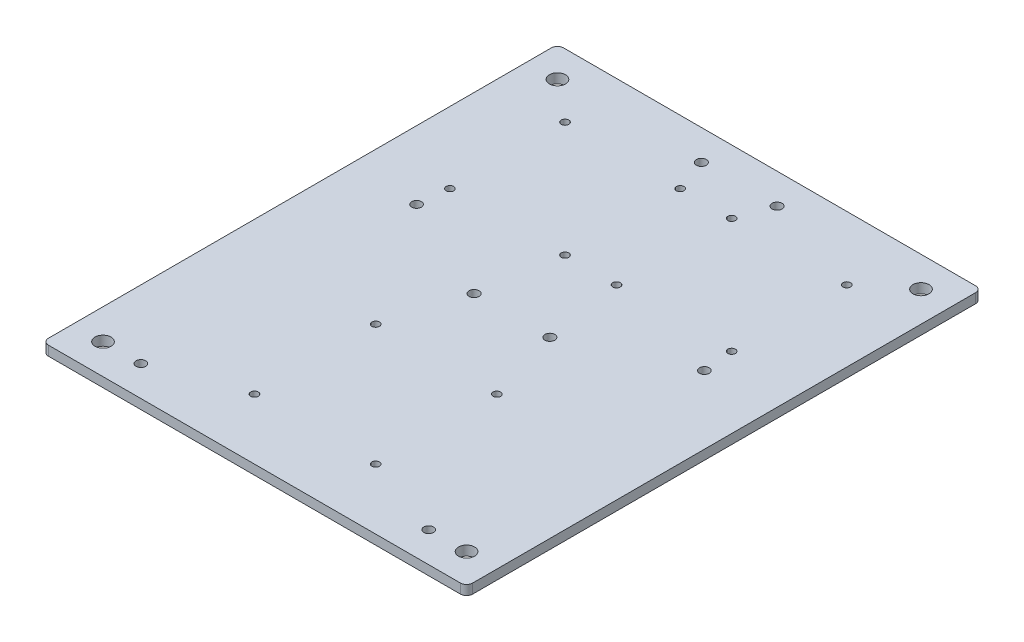
ISO-10303-21;
HEADER;
FILE_DESCRIPTION(('STEP AP214'),'2;1');
FILE_NAME('part.step','',(''),(''),'','','');
FILE_SCHEMA(('AUTOMOTIVE_DESIGN { 1 0 10303 214 1 1 1 1 }'));
ENDSEC;
DATA;
#1=APPLICATION_CONTEXT('core data for automotive mechanical design processes');
#2=APPLICATION_PROTOCOL_DEFINITION('international standard','automotive_design',2000,#1);
#3=PRODUCT_CONTEXT('',#1,'mechanical');
#4=PRODUCT('Part','Part','',(#3));
#5=PRODUCT_RELATED_PRODUCT_CATEGORY('part','',(#4));
#6=PRODUCT_DEFINITION_FORMATION('','',#4);
#7=PRODUCT_DEFINITION_CONTEXT('part definition',#1,'design');
#8=PRODUCT_DEFINITION('design','',#6,#7);
#9=PRODUCT_DEFINITION_SHAPE('','',#8);
#10=(LENGTH_UNIT() NAMED_UNIT(*) SI_UNIT(.MILLI.,.METRE.));
#11=(NAMED_UNIT(*) PLANE_ANGLE_UNIT() SI_UNIT($,.RADIAN.));
#12=(NAMED_UNIT(*) SI_UNIT($,.STERADIAN.) SOLID_ANGLE_UNIT());
#13=UNCERTAINTY_MEASURE_WITH_UNIT(LENGTH_MEASURE(1.E-05),#10,'distance_accuracy_value','');
#14=(GEOMETRIC_REPRESENTATION_CONTEXT(3) GLOBAL_UNCERTAINTY_ASSIGNED_CONTEXT((#13)) GLOBAL_UNIT_ASSIGNED_CONTEXT((#10,
#11,#12)) REPRESENTATION_CONTEXT('',''));
#15=CARTESIAN_POINT('',(0.,0.,0.));
#16=DIRECTION('',(0.,0.,1.));
#17=DIRECTION('',(1.,0.,0.));
#18=AXIS2_PLACEMENT_3D('',#15,#16,#17);
#19=CARTESIAN_POINT('',(0.,3.175,0.));
#20=DIRECTION('',(0.,-1.,0.));
#21=DIRECTION('',(0.,0.,-1.));
#22=AXIS2_PLACEMENT_3D('',#19,#20,#21);
#23=PLANE('',#22);
#24=CARTESIAN_POINT('',(-60.,3.175,-75.));
#25=DIRECTION('',(0.,1.,0.));
#26=DIRECTION('',(0.,0.,1.));
#27=AXIS2_PLACEMENT_3D('',#24,#25,#26);
#28=CIRCLE('',#27,2.65);
#29=CARTESIAN_POINT('',(-60.,3.175,-72.35));
#30=VERTEX_POINT('',#29);
#31=EDGE_CURVE('E332',#30,#30,#28,.T.);
#32=ORIENTED_EDGE('',*,*,#31,.F.);
#33=EDGE_LOOP('',(#32));
#34=FACE_BOUND('',#33,.T.);
#35=CARTESIAN_POINT('',(60.,3.175,-75.));
#36=DIRECTION('',(0.,1.,0.));
#37=DIRECTION('',(0.,0.,1.));
#38=AXIS2_PLACEMENT_3D('',#35,#36,#37);
#39=CIRCLE('',#38,2.64999999999999);
#40=CARTESIAN_POINT('',(60.,3.175,-72.35));
#41=VERTEX_POINT('',#40);
#42=EDGE_CURVE('E326',#41,#41,#39,.T.);
#43=ORIENTED_EDGE('',*,*,#42,.F.);
#44=EDGE_LOOP('',(#43));
#45=FACE_BOUND('',#44,.T.);
#46=CARTESIAN_POINT('',(-60.,3.175,75.));
#47=DIRECTION('',(0.,1.,0.));
#48=DIRECTION('',(0.,0.,1.));
#49=AXIS2_PLACEMENT_3D('',#46,#47,#48);
#50=CIRCLE('',#49,2.65);
#51=CARTESIAN_POINT('',(-60.,3.175,77.65));
#52=VERTEX_POINT('',#51);
#53=EDGE_CURVE('E320',#52,#52,#50,.T.);
#54=ORIENTED_EDGE('',*,*,#53,.F.);
#55=EDGE_LOOP('',(#54));
#56=FACE_BOUND('',#55,.T.);
#57=CARTESIAN_POINT('',(60.,3.175,75.));
#58=DIRECTION('',(0.,1.,0.));
#59=DIRECTION('',(0.,0.,1.));
#60=AXIS2_PLACEMENT_3D('',#57,#58,#59);
#61=CIRCLE('',#60,2.64999999999999);
#62=CARTESIAN_POINT('',(60.,3.175,77.65));
#63=VERTEX_POINT('',#62);
#64=EDGE_CURVE('E314',#63,#63,#61,.T.);
#65=ORIENTED_EDGE('',*,*,#64,.F.);
#66=EDGE_LOOP('',(#65));
#67=FACE_BOUND('',#66,.T.);
#68=CARTESIAN_POINT('',(-12.5,3.175,-75.));
#69=DIRECTION('',(0.,1.,0.));
#70=DIRECTION('',(0.,0.,1.));
#71=AXIS2_PLACEMENT_3D('',#68,#69,#70);
#72=CIRCLE('',#71,1.65);
#73=CARTESIAN_POINT('',(-12.5,3.175,-73.35));
#74=VERTEX_POINT('',#73);
#75=EDGE_CURVE('E308',#74,#74,#72,.T.);
#76=ORIENTED_EDGE('',*,*,#75,.F.);
#77=EDGE_LOOP('',(#76));
#78=FACE_BOUND('',#77,.T.);
#79=CARTESIAN_POINT('',(12.5,3.175,-75.));
#80=DIRECTION('',(0.,1.,0.));
#81=DIRECTION('',(0.,0.,1.));
#82=AXIS2_PLACEMENT_3D('',#79,#80,#81);
#83=CIRCLE('',#82,1.65);
#84=CARTESIAN_POINT('',(12.5,3.175,-73.35));
#85=VERTEX_POINT('',#84);
#86=EDGE_CURVE('E302',#85,#85,#83,.T.);
#87=ORIENTED_EDGE('',*,*,#86,.F.);
#88=EDGE_LOOP('',(#87));
#89=FACE_BOUND('',#88,.T.);
#90=CARTESIAN_POINT('',(-12.5,3.175,0.));
#91=DIRECTION('',(0.,1.,0.));
#92=DIRECTION('',(0.,0.,1.));
#93=AXIS2_PLACEMENT_3D('',#90,#91,#92);
#94=CIRCLE('',#93,1.65);
#95=CARTESIAN_POINT('',(-12.5,3.175,1.64999999999998));
#96=VERTEX_POINT('',#95);
#97=EDGE_CURVE('E296',#96,#96,#94,.T.);
#98=ORIENTED_EDGE('',*,*,#97,.F.);
#99=EDGE_LOOP('',(#98));
#100=FACE_BOUND('',#99,.T.);
#101=CARTESIAN_POINT('',(12.5,3.175,0.));
#102=DIRECTION('',(0.,1.,0.));
#103=DIRECTION('',(0.,0.,1.));
#104=AXIS2_PLACEMENT_3D('',#101,#102,#103);
#105=CIRCLE('',#104,1.65);
#106=CARTESIAN_POINT('',(12.5,3.175,1.64999999999998));
#107=VERTEX_POINT('',#106);
#108=EDGE_CURVE('E290',#107,#107,#105,.T.);
#109=ORIENTED_EDGE('',*,*,#108,.F.);
#110=EDGE_LOOP('',(#109));
#111=FACE_BOUND('',#110,.T.);
#112=CARTESIAN_POINT('',(-47.5,3.175,-16.));
#113=DIRECTION('',(0.,1.,0.));
#114=DIRECTION('',(0.,0.,1.));
#115=AXIS2_PLACEMENT_3D('',#112,#113,#114);
#116=CIRCLE('',#115,1.6);
#117=CARTESIAN_POINT('',(-47.5,3.175,-14.4));
#118=VERTEX_POINT('',#117);
#119=EDGE_CURVE('E284',#118,#118,#116,.T.);
#120=ORIENTED_EDGE('',*,*,#119,.F.);
#121=EDGE_LOOP('',(#120));
#122=FACE_BOUND('',#121,.T.);
#123=CARTESIAN_POINT('',(47.5,3.175,-16.));
#124=DIRECTION('',(0.,1.,0.));
#125=DIRECTION('',(0.,0.,1.));
#126=AXIS2_PLACEMENT_3D('',#123,#124,#125);
#127=CIRCLE('',#126,1.6);
#128=CARTESIAN_POINT('',(47.5,3.175,-14.4));
#129=VERTEX_POINT('',#128);
#130=EDGE_CURVE('E278',#129,#129,#127,.T.);
#131=ORIENTED_EDGE('',*,*,#130,.F.);
#132=EDGE_LOOP('',(#131));
#133=FACE_BOUND('',#132,.T.);
#134=CARTESIAN_POINT('',(47.5,3.175,75.));
#135=DIRECTION('',(0.,1.,0.));
#136=DIRECTION('',(0.,0.,1.));
#137=AXIS2_PLACEMENT_3D('',#134,#135,#136);
#138=CIRCLE('',#137,1.6);
#139=CARTESIAN_POINT('',(47.5,3.175,76.6));
#140=VERTEX_POINT('',#139);
#141=EDGE_CURVE('E272',#140,#140,#138,.T.);
#142=ORIENTED_EDGE('',*,*,#141,.F.);
#143=EDGE_LOOP('',(#142));
#144=FACE_BOUND('',#143,.T.);
#145=CARTESIAN_POINT('',(-47.5,3.175,75.));
#146=DIRECTION('',(0.,1.,0.));
#147=DIRECTION('',(0.,0.,1.));
#148=AXIS2_PLACEMENT_3D('',#145,#146,#147);
#149=CIRCLE('',#148,1.6);
#150=CARTESIAN_POINT('',(-47.5,3.175,76.6));
#151=VERTEX_POINT('',#150);
#152=EDGE_CURVE('E266',#151,#151,#149,.T.);
#153=ORIENTED_EDGE('',*,*,#152,.F.);
#154=EDGE_LOOP('',(#153));
#155=FACE_BOUND('',#154,.T.);
#156=CARTESIAN_POINT('',(-46.5,3.175,-64.));
#157=DIRECTION('',(0.,1.,0.));
#158=DIRECTION('',(0.,0.,1.));
#159=AXIS2_PLACEMENT_3D('',#156,#157,#158);
#160=CIRCLE('',#159,1.25);
#161=CARTESIAN_POINT('',(-46.5,3.175,-62.75));
#162=VERTEX_POINT('',#161);
#163=EDGE_CURVE('E260',#162,#162,#160,.T.);
#164=ORIENTED_EDGE('',*,*,#163,.F.);
#165=EDGE_LOOP('',(#164));
#166=FACE_BOUND('',#165,.T.);
#167=CARTESIAN_POINT('',(-46.5,3.175,-26.));
#168=DIRECTION('',(0.,1.,0.));
#169=DIRECTION('',(0.,0.,1.));
#170=AXIS2_PLACEMENT_3D('',#167,#168,#169);
#171=CIRCLE('',#170,1.25);
#172=CARTESIAN_POINT('',(-46.5,3.175,-24.75));
#173=VERTEX_POINT('',#172);
#174=EDGE_CURVE('E254',#173,#173,#171,.T.);
#175=ORIENTED_EDGE('',*,*,#174,.F.);
#176=EDGE_LOOP('',(#175));
#177=FACE_BOUND('',#176,.T.);
#178=CARTESIAN_POINT('',(-8.5,3.175,-26.));
#179=DIRECTION('',(0.,1.,0.));
#180=DIRECTION('',(0.,0.,1.));
#181=AXIS2_PLACEMENT_3D('',#178,#179,#180);
#182=CIRCLE('',#181,1.25);
#183=CARTESIAN_POINT('',(-8.5,3.175,-24.75));
#184=VERTEX_POINT('',#183);
#185=EDGE_CURVE('E248',#184,#184,#182,.T.);
#186=ORIENTED_EDGE('',*,*,#185,.F.);
#187=EDGE_LOOP('',(#186));
#188=FACE_BOUND('',#187,.T.);
#189=CARTESIAN_POINT('',(-8.5,3.175,-64.));
#190=DIRECTION('',(0.,1.,0.));
#191=DIRECTION('',(0.,0.,1.));
#192=AXIS2_PLACEMENT_3D('',#189,#190,#191);
#193=CIRCLE('',#192,1.25);
#194=CARTESIAN_POINT('',(-8.5,3.175,-62.75));
#195=VERTEX_POINT('',#194);
#196=EDGE_CURVE('E242',#195,#195,#193,.T.);
#197=ORIENTED_EDGE('',*,*,#196,.F.);
#198=EDGE_LOOP('',(#197));
#199=FACE_BOUND('',#198,.T.);
#200=CARTESIAN_POINT('',(8.50000000000001,3.175,-64.));
#201=DIRECTION('',(0.,1.,0.));
#202=DIRECTION('',(0.,0.,1.));
#203=AXIS2_PLACEMENT_3D('',#200,#201,#202);
#204=CIRCLE('',#203,1.25);
#205=CARTESIAN_POINT('',(8.50000000000001,3.175,-62.75));
#206=VERTEX_POINT('',#205);
#207=EDGE_CURVE('E236',#206,#206,#204,.T.);
#208=ORIENTED_EDGE('',*,*,#207,.F.);
#209=EDGE_LOOP('',(#208));
#210=FACE_BOUND('',#209,.T.);
#211=CARTESIAN_POINT('',(46.5,3.175,-64.));
#212=DIRECTION('',(0.,1.,0.));
#213=DIRECTION('',(0.,0.,1.));
#214=AXIS2_PLACEMENT_3D('',#211,#212,#213);
#215=CIRCLE('',#214,1.25);
#216=CARTESIAN_POINT('',(46.5,3.175,-62.75));
#217=VERTEX_POINT('',#216);
#218=EDGE_CURVE('E230',#217,#217,#215,.T.);
#219=ORIENTED_EDGE('',*,*,#218,.F.);
#220=EDGE_LOOP('',(#219));
#221=FACE_BOUND('',#220,.T.);
#222=CARTESIAN_POINT('',(8.50000000000001,3.175,-26.));
#223=DIRECTION('',(0.,1.,0.));
#224=DIRECTION('',(0.,0.,1.));
#225=AXIS2_PLACEMENT_3D('',#222,#223,#224);
#226=CIRCLE('',#225,1.25);
#227=CARTESIAN_POINT('',(8.50000000000001,3.175,-24.75));
#228=VERTEX_POINT('',#227);
#229=EDGE_CURVE('E224',#228,#228,#226,.T.);
#230=ORIENTED_EDGE('',*,*,#229,.F.);
#231=EDGE_LOOP('',(#230));
#232=FACE_BOUND('',#231,.T.);
#233=CARTESIAN_POINT('',(46.5,3.175,-26.));
#234=DIRECTION('',(0.,1.,0.));
#235=DIRECTION('',(0.,0.,1.));
#236=AXIS2_PLACEMENT_3D('',#233,#234,#235);
#237=CIRCLE('',#236,1.25);
#238=CARTESIAN_POINT('',(46.5,3.175,-24.75));
#239=VERTEX_POINT('',#238);
#240=EDGE_CURVE('E218',#239,#239,#237,.T.);
#241=ORIENTED_EDGE('',*,*,#240,.F.);
#242=EDGE_LOOP('',(#241));
#243=FACE_BOUND('',#242,.T.);
#244=CARTESIAN_POINT('',(-20.,3.175,25.));
#245=DIRECTION('',(0.,1.,0.));
#246=DIRECTION('',(0.,0.,1.));
#247=AXIS2_PLACEMENT_3D('',#244,#245,#246);
#248=CIRCLE('',#247,1.25);
#249=CARTESIAN_POINT('',(-20.,3.175,26.25));
#250=VERTEX_POINT('',#249);
#251=EDGE_CURVE('E212',#250,#250,#248,.T.);
#252=ORIENTED_EDGE('',*,*,#251,.F.);
#253=EDGE_LOOP('',(#252));
#254=FACE_BOUND('',#253,.T.);
#255=CARTESIAN_POINT('',(-20.,3.175,65.));
#256=DIRECTION('',(0.,1.,0.));
#257=DIRECTION('',(0.,0.,1.));
#258=AXIS2_PLACEMENT_3D('',#255,#256,#257);
#259=CIRCLE('',#258,1.25);
#260=CARTESIAN_POINT('',(-20.,3.175,66.25));
#261=VERTEX_POINT('',#260);
#262=EDGE_CURVE('E200',#261,#261,#259,.T.);
#263=ORIENTED_EDGE('',*,*,#262,.F.);
#264=EDGE_LOOP('',(#263));
#265=FACE_BOUND('',#264,.T.);
#266=CARTESIAN_POINT('',(20.,3.175,65.));
#267=DIRECTION('',(0.,1.,0.));
#268=DIRECTION('',(0.,0.,1.));
#269=AXIS2_PLACEMENT_3D('',#266,#267,#268);
#270=CIRCLE('',#269,1.25);
#271=CARTESIAN_POINT('',(20.,3.175,66.25));
#272=VERTEX_POINT('',#271);
#273=EDGE_CURVE('E145',#272,#272,#270,.T.);
#274=ORIENTED_EDGE('',*,*,#273,.F.);
#275=EDGE_LOOP('',(#274));
#276=FACE_BOUND('',#275,.T.);
#277=DIRECTION('',(1.,0.,0.));
#278=VECTOR('',#277,1.);
#279=CARTESIAN_POINT('',(-70.,3.175,85.));
#280=LINE('',#279,#278);
#281=CARTESIAN_POINT('',(-68.,3.175,85.));
#282=VERTEX_POINT('',#281);
#283=CARTESIAN_POINT('',(68.,3.175,85.));
#284=VERTEX_POINT('',#283);
#285=EDGE_CURVE('E148',#282,#284,#280,.T.);
#286=ORIENTED_EDGE('',*,*,#285,.T.);
#287=CARTESIAN_POINT('',(68.,3.175,83.));
#288=DIRECTION('',(0.,-1.,0.));
#289=DIRECTION('',(0.,0.,-1.));
#290=AXIS2_PLACEMENT_3D('',#287,#288,#289);
#291=CIRCLE('',#290,2.);
#292=CARTESIAN_POINT('',(70.,3.175,83.));
#293=VERTEX_POINT('',#292);
#294=EDGE_CURVE('E166',#284,#293,#291,.F.);
#295=ORIENTED_EDGE('',*,*,#294,.T.);
#296=DIRECTION('',(0.,0.,-1.));
#297=VECTOR('',#296,1.);
#298=CARTESIAN_POINT('',(70.,3.175,85.));
#299=LINE('',#298,#297);
#300=CARTESIAN_POINT('',(70.,3.175,-83.));
#301=VERTEX_POINT('',#300);
#302=EDGE_CURVE('E130',#293,#301,#299,.T.);
#303=ORIENTED_EDGE('',*,*,#302,.T.);
#304=CARTESIAN_POINT('',(68.,3.175,-83.));
#305=DIRECTION('',(0.,-1.,0.));
#306=DIRECTION('',(0.,0.,-1.));
#307=AXIS2_PLACEMENT_3D('',#304,#305,#306);
#308=CIRCLE('',#307,2.);
#309=CARTESIAN_POINT('',(68.,3.175,-85.));
#310=VERTEX_POINT('',#309);
#311=EDGE_CURVE('E162',#301,#310,#308,.F.);
#312=ORIENTED_EDGE('',*,*,#311,.T.);
#313=DIRECTION('',(-1.,0.,0.));
#314=VECTOR('',#313,1.);
#315=CARTESIAN_POINT('',(-70.,3.175,-85.));
#316=LINE('',#315,#314);
#317=CARTESIAN_POINT('',(-68.,3.175,-85.));
#318=VERTEX_POINT('',#317);
#319=EDGE_CURVE('E175',#310,#318,#316,.T.);
#320=ORIENTED_EDGE('',*,*,#319,.T.);
#321=CARTESIAN_POINT('',(-68.,3.175,-83.));
#322=DIRECTION('',(0.,-1.,0.));
#323=DIRECTION('',(0.,0.,-1.));
#324=AXIS2_PLACEMENT_3D('',#321,#322,#323);
#325=CIRCLE('',#324,2.);
#326=CARTESIAN_POINT('',(-70.,3.175,-83.));
#327=VERTEX_POINT('',#326);
#328=EDGE_CURVE('E65',#318,#327,#325,.F.);
#329=ORIENTED_EDGE('',*,*,#328,.T.);
#330=DIRECTION('',(0.,0.,1.));
#331=VECTOR('',#330,1.);
#332=CARTESIAN_POINT('',(-70.,3.175,85.));
#333=LINE('',#332,#331);
#334=CARTESIAN_POINT('',(-70.,3.175,83.));
#335=VERTEX_POINT('',#334);
#336=EDGE_CURVE('E181',#327,#335,#333,.T.);
#337=ORIENTED_EDGE('',*,*,#336,.T.);
#338=CARTESIAN_POINT('',(-68.,3.175,83.));
#339=DIRECTION('',(0.,-1.,0.));
#340=DIRECTION('',(0.,0.,-1.));
#341=AXIS2_PLACEMENT_3D('',#338,#339,#340);
#342=CIRCLE('',#341,2.);
#343=EDGE_CURVE('E164',#335,#282,#342,.F.);
#344=ORIENTED_EDGE('',*,*,#343,.T.);
#345=EDGE_LOOP('',(#286,#295,#303,#312,#320,#329,#337,#344));
#346=FACE_BOUND('',#345,.T.);
#347=CARTESIAN_POINT('',(20.,3.175,25.));
#348=DIRECTION('',(0.,1.,0.));
#349=DIRECTION('',(0.,0.,1.));
#350=AXIS2_PLACEMENT_3D('',#347,#348,#349);
#351=CIRCLE('',#350,1.25);
#352=CARTESIAN_POINT('',(20.,3.175,26.25));
#353=VERTEX_POINT('',#352);
#354=EDGE_CURVE('E206',#353,#353,#351,.T.);
#355=ORIENTED_EDGE('',*,*,#354,.F.);
#356=EDGE_LOOP('',(#355));
#357=FACE_BOUND('',#356,.T.);
#358=ADVANCED_FACE('F43',(#34,#45,#56,#67,#78,#89,#100,#111,#122,#133,#144,#155,#166,#177,#188,
#199,#210,#221,#232,#243,#254,#265,#276,#346,#357),#23,.F.);
#359=CARTESIAN_POINT('',(0.,0.,0.));
#360=DIRECTION('',(0.,-1.,0.));
#361=DIRECTION('',(0.,0.,-1.));
#362=AXIS2_PLACEMENT_3D('',#359,#360,#361);
#363=PLANE('',#362);
#364=CARTESIAN_POINT('',(-60.,0.,-75.));
#365=DIRECTION('',(0.,1.,0.));
#366=DIRECTION('',(0.,0.,1.));
#367=AXIS2_PLACEMENT_3D('',#364,#365,#366);
#368=CIRCLE('',#367,2.65);
#369=CARTESIAN_POINT('',(-60.,0.,-72.35));
#370=VERTEX_POINT('',#369);
#371=EDGE_CURVE('E329',#370,#370,#368,.T.);
#372=ORIENTED_EDGE('',*,*,#371,.T.);
#373=EDGE_LOOP('',(#372));
#374=FACE_BOUND('',#373,.T.);
#375=CARTESIAN_POINT('',(60.,0.,-75.));
#376=DIRECTION('',(0.,1.,0.));
#377=DIRECTION('',(0.,0.,1.));
#378=AXIS2_PLACEMENT_3D('',#375,#376,#377);
#379=CIRCLE('',#378,2.64999999999999);
#380=CARTESIAN_POINT('',(60.,0.,-72.35));
#381=VERTEX_POINT('',#380);
#382=EDGE_CURVE('E323',#381,#381,#379,.T.);
#383=ORIENTED_EDGE('',*,*,#382,.T.);
#384=EDGE_LOOP('',(#383));
#385=FACE_BOUND('',#384,.T.);
#386=CARTESIAN_POINT('',(-60.,0.,75.));
#387=DIRECTION('',(0.,1.,0.));
#388=DIRECTION('',(0.,0.,1.));
#389=AXIS2_PLACEMENT_3D('',#386,#387,#388);
#390=CIRCLE('',#389,2.65);
#391=CARTESIAN_POINT('',(-60.,0.,77.65));
#392=VERTEX_POINT('',#391);
#393=EDGE_CURVE('E317',#392,#392,#390,.T.);
#394=ORIENTED_EDGE('',*,*,#393,.T.);
#395=EDGE_LOOP('',(#394));
#396=FACE_BOUND('',#395,.T.);
#397=CARTESIAN_POINT('',(60.,0.,75.));
#398=DIRECTION('',(0.,1.,0.));
#399=DIRECTION('',(0.,0.,1.));
#400=AXIS2_PLACEMENT_3D('',#397,#398,#399);
#401=CIRCLE('',#400,2.64999999999999);
#402=CARTESIAN_POINT('',(60.,0.,77.65));
#403=VERTEX_POINT('',#402);
#404=EDGE_CURVE('E311',#403,#403,#401,.T.);
#405=ORIENTED_EDGE('',*,*,#404,.T.);
#406=EDGE_LOOP('',(#405));
#407=FACE_BOUND('',#406,.T.);
#408=CARTESIAN_POINT('',(-12.5,0.,-75.));
#409=DIRECTION('',(0.,1.,0.));
#410=DIRECTION('',(0.,0.,1.));
#411=AXIS2_PLACEMENT_3D('',#408,#409,#410);
#412=CIRCLE('',#411,1.65);
#413=CARTESIAN_POINT('',(-12.5,0.,-73.35));
#414=VERTEX_POINT('',#413);
#415=EDGE_CURVE('E305',#414,#414,#412,.T.);
#416=ORIENTED_EDGE('',*,*,#415,.T.);
#417=EDGE_LOOP('',(#416));
#418=FACE_BOUND('',#417,.T.);
#419=CARTESIAN_POINT('',(12.5,0.,-75.));
#420=DIRECTION('',(0.,1.,0.));
#421=DIRECTION('',(0.,0.,1.));
#422=AXIS2_PLACEMENT_3D('',#419,#420,#421);
#423=CIRCLE('',#422,1.65);
#424=CARTESIAN_POINT('',(12.5,0.,-73.35));
#425=VERTEX_POINT('',#424);
#426=EDGE_CURVE('E299',#425,#425,#423,.T.);
#427=ORIENTED_EDGE('',*,*,#426,.T.);
#428=EDGE_LOOP('',(#427));
#429=FACE_BOUND('',#428,.T.);
#430=CARTESIAN_POINT('',(-12.5,0.,0.));
#431=DIRECTION('',(0.,1.,0.));
#432=DIRECTION('',(0.,0.,1.));
#433=AXIS2_PLACEMENT_3D('',#430,#431,#432);
#434=CIRCLE('',#433,1.65);
#435=CARTESIAN_POINT('',(-12.5,0.,1.64999999999998));
#436=VERTEX_POINT('',#435);
#437=EDGE_CURVE('E293',#436,#436,#434,.T.);
#438=ORIENTED_EDGE('',*,*,#437,.T.);
#439=EDGE_LOOP('',(#438));
#440=FACE_BOUND('',#439,.T.);
#441=CARTESIAN_POINT('',(12.5,0.,0.));
#442=DIRECTION('',(0.,1.,0.));
#443=DIRECTION('',(0.,0.,1.));
#444=AXIS2_PLACEMENT_3D('',#441,#442,#443);
#445=CIRCLE('',#444,1.65);
#446=CARTESIAN_POINT('',(12.5,0.,1.64999999999998));
#447=VERTEX_POINT('',#446);
#448=EDGE_CURVE('E287',#447,#447,#445,.T.);
#449=ORIENTED_EDGE('',*,*,#448,.T.);
#450=EDGE_LOOP('',(#449));
#451=FACE_BOUND('',#450,.T.);
#452=CARTESIAN_POINT('',(-47.5,0.,-16.));
#453=DIRECTION('',(0.,1.,0.));
#454=DIRECTION('',(0.,0.,1.));
#455=AXIS2_PLACEMENT_3D('',#452,#453,#454);
#456=CIRCLE('',#455,1.6);
#457=CARTESIAN_POINT('',(-47.5,0.,-14.4));
#458=VERTEX_POINT('',#457);
#459=EDGE_CURVE('E281',#458,#458,#456,.T.);
#460=ORIENTED_EDGE('',*,*,#459,.T.);
#461=EDGE_LOOP('',(#460));
#462=FACE_BOUND('',#461,.T.);
#463=CARTESIAN_POINT('',(47.5,0.,-16.));
#464=DIRECTION('',(0.,1.,0.));
#465=DIRECTION('',(0.,0.,1.));
#466=AXIS2_PLACEMENT_3D('',#463,#464,#465);
#467=CIRCLE('',#466,1.6);
#468=CARTESIAN_POINT('',(47.5,0.,-14.4));
#469=VERTEX_POINT('',#468);
#470=EDGE_CURVE('E275',#469,#469,#467,.T.);
#471=ORIENTED_EDGE('',*,*,#470,.T.);
#472=EDGE_LOOP('',(#471));
#473=FACE_BOUND('',#472,.T.);
#474=CARTESIAN_POINT('',(47.5,0.,75.));
#475=DIRECTION('',(0.,1.,0.));
#476=DIRECTION('',(0.,0.,1.));
#477=AXIS2_PLACEMENT_3D('',#474,#475,#476);
#478=CIRCLE('',#477,1.6);
#479=CARTESIAN_POINT('',(47.5,0.,76.6));
#480=VERTEX_POINT('',#479);
#481=EDGE_CURVE('E269',#480,#480,#478,.T.);
#482=ORIENTED_EDGE('',*,*,#481,.T.);
#483=EDGE_LOOP('',(#482));
#484=FACE_BOUND('',#483,.T.);
#485=CARTESIAN_POINT('',(-47.5,0.,75.));
#486=DIRECTION('',(0.,1.,0.));
#487=DIRECTION('',(0.,0.,1.));
#488=AXIS2_PLACEMENT_3D('',#485,#486,#487);
#489=CIRCLE('',#488,1.6);
#490=CARTESIAN_POINT('',(-47.5,0.,76.6));
#491=VERTEX_POINT('',#490);
#492=EDGE_CURVE('E263',#491,#491,#489,.T.);
#493=ORIENTED_EDGE('',*,*,#492,.T.);
#494=EDGE_LOOP('',(#493));
#495=FACE_BOUND('',#494,.T.);
#496=CARTESIAN_POINT('',(-46.5,0.,-64.));
#497=DIRECTION('',(0.,1.,0.));
#498=DIRECTION('',(0.,0.,1.));
#499=AXIS2_PLACEMENT_3D('',#496,#497,#498);
#500=CIRCLE('',#499,1.25);
#501=CARTESIAN_POINT('',(-46.5,0.,-62.75));
#502=VERTEX_POINT('',#501);
#503=EDGE_CURVE('E257',#502,#502,#500,.T.);
#504=ORIENTED_EDGE('',*,*,#503,.T.);
#505=EDGE_LOOP('',(#504));
#506=FACE_BOUND('',#505,.T.);
#507=CARTESIAN_POINT('',(-46.5,0.,-26.));
#508=DIRECTION('',(0.,1.,0.));
#509=DIRECTION('',(0.,0.,1.));
#510=AXIS2_PLACEMENT_3D('',#507,#508,#509);
#511=CIRCLE('',#510,1.25);
#512=CARTESIAN_POINT('',(-46.5,0.,-24.75));
#513=VERTEX_POINT('',#512);
#514=EDGE_CURVE('E251',#513,#513,#511,.T.);
#515=ORIENTED_EDGE('',*,*,#514,.T.);
#516=EDGE_LOOP('',(#515));
#517=FACE_BOUND('',#516,.T.);
#518=CARTESIAN_POINT('',(-8.5,0.,-26.));
#519=DIRECTION('',(0.,1.,0.));
#520=DIRECTION('',(0.,0.,1.));
#521=AXIS2_PLACEMENT_3D('',#518,#519,#520);
#522=CIRCLE('',#521,1.25);
#523=CARTESIAN_POINT('',(-8.5,0.,-24.75));
#524=VERTEX_POINT('',#523);
#525=EDGE_CURVE('E245',#524,#524,#522,.T.);
#526=ORIENTED_EDGE('',*,*,#525,.T.);
#527=EDGE_LOOP('',(#526));
#528=FACE_BOUND('',#527,.T.);
#529=CARTESIAN_POINT('',(-8.5,0.,-64.));
#530=DIRECTION('',(0.,1.,0.));
#531=DIRECTION('',(0.,0.,1.));
#532=AXIS2_PLACEMENT_3D('',#529,#530,#531);
#533=CIRCLE('',#532,1.25);
#534=CARTESIAN_POINT('',(-8.5,0.,-62.75));
#535=VERTEX_POINT('',#534);
#536=EDGE_CURVE('E239',#535,#535,#533,.T.);
#537=ORIENTED_EDGE('',*,*,#536,.T.);
#538=EDGE_LOOP('',(#537));
#539=FACE_BOUND('',#538,.T.);
#540=CARTESIAN_POINT('',(8.50000000000001,0.,-64.));
#541=DIRECTION('',(0.,1.,0.));
#542=DIRECTION('',(0.,0.,1.));
#543=AXIS2_PLACEMENT_3D('',#540,#541,#542);
#544=CIRCLE('',#543,1.25);
#545=CARTESIAN_POINT('',(8.50000000000001,0.,-62.75));
#546=VERTEX_POINT('',#545);
#547=EDGE_CURVE('E233',#546,#546,#544,.T.);
#548=ORIENTED_EDGE('',*,*,#547,.T.);
#549=EDGE_LOOP('',(#548));
#550=FACE_BOUND('',#549,.T.);
#551=CARTESIAN_POINT('',(46.5,0.,-64.));
#552=DIRECTION('',(0.,1.,0.));
#553=DIRECTION('',(0.,0.,1.));
#554=AXIS2_PLACEMENT_3D('',#551,#552,#553);
#555=CIRCLE('',#554,1.25);
#556=CARTESIAN_POINT('',(46.5,0.,-62.75));
#557=VERTEX_POINT('',#556);
#558=EDGE_CURVE('E227',#557,#557,#555,.T.);
#559=ORIENTED_EDGE('',*,*,#558,.T.);
#560=EDGE_LOOP('',(#559));
#561=FACE_BOUND('',#560,.T.);
#562=CARTESIAN_POINT('',(8.50000000000001,0.,-26.));
#563=DIRECTION('',(0.,1.,0.));
#564=DIRECTION('',(0.,0.,1.));
#565=AXIS2_PLACEMENT_3D('',#562,#563,#564);
#566=CIRCLE('',#565,1.25);
#567=CARTESIAN_POINT('',(8.50000000000001,0.,-24.75));
#568=VERTEX_POINT('',#567);
#569=EDGE_CURVE('E221',#568,#568,#566,.T.);
#570=ORIENTED_EDGE('',*,*,#569,.T.);
#571=EDGE_LOOP('',(#570));
#572=FACE_BOUND('',#571,.T.);
#573=CARTESIAN_POINT('',(46.5,0.,-26.));
#574=DIRECTION('',(0.,1.,0.));
#575=DIRECTION('',(0.,0.,1.));
#576=AXIS2_PLACEMENT_3D('',#573,#574,#575);
#577=CIRCLE('',#576,1.25);
#578=CARTESIAN_POINT('',(46.5,0.,-24.75));
#579=VERTEX_POINT('',#578);
#580=EDGE_CURVE('E215',#579,#579,#577,.T.);
#581=ORIENTED_EDGE('',*,*,#580,.T.);
#582=EDGE_LOOP('',(#581));
#583=FACE_BOUND('',#582,.T.);
#584=CARTESIAN_POINT('',(-20.,0.,25.));
#585=DIRECTION('',(0.,1.,0.));
#586=DIRECTION('',(0.,0.,1.));
#587=AXIS2_PLACEMENT_3D('',#584,#585,#586);
#588=CIRCLE('',#587,1.25);
#589=CARTESIAN_POINT('',(-20.,0.,26.25));
#590=VERTEX_POINT('',#589);
#591=EDGE_CURVE('E209',#590,#590,#588,.T.);
#592=ORIENTED_EDGE('',*,*,#591,.T.);
#593=EDGE_LOOP('',(#592));
#594=FACE_BOUND('',#593,.T.);
#595=CARTESIAN_POINT('',(20.,0.,25.));
#596=DIRECTION('',(0.,1.,0.));
#597=DIRECTION('',(0.,0.,1.));
#598=AXIS2_PLACEMENT_3D('',#595,#596,#597);
#599=CIRCLE('',#598,1.25);
#600=CARTESIAN_POINT('',(20.,0.,26.25));
#601=VERTEX_POINT('',#600);
#602=EDGE_CURVE('E203',#601,#601,#599,.T.);
#603=ORIENTED_EDGE('',*,*,#602,.T.);
#604=EDGE_LOOP('',(#603));
#605=FACE_BOUND('',#604,.T.);
#606=DIRECTION('',(0.,0.,-1.));
#607=VECTOR('',#606,1.);
#608=CARTESIAN_POINT('',(70.,0.,85.));
#609=LINE('',#608,#607);
#610=CARTESIAN_POINT('',(70.,0.,83.));
#611=VERTEX_POINT('',#610);
#612=CARTESIAN_POINT('',(70.,0.,-83.));
#613=VERTEX_POINT('',#612);
#614=EDGE_CURVE('E127',#611,#613,#609,.T.);
#615=ORIENTED_EDGE('',*,*,#614,.F.);
#616=CARTESIAN_POINT('',(68.,0.,83.));
#617=DIRECTION('',(0.,-1.,0.));
#618=DIRECTION('',(0.,0.,-1.));
#619=AXIS2_PLACEMENT_3D('',#616,#617,#618);
#620=CIRCLE('',#619,2.);
#621=CARTESIAN_POINT('',(68.,0.,85.));
#622=VERTEX_POINT('',#621);
#623=EDGE_CURVE('E110',#611,#622,#620,.T.);
#624=ORIENTED_EDGE('',*,*,#623,.T.);
#625=DIRECTION('',(1.,0.,0.));
#626=VECTOR('',#625,1.);
#627=CARTESIAN_POINT('',(-70.,0.,85.));
#628=LINE('',#627,#626);
#629=CARTESIAN_POINT('',(-68.,0.,85.));
#630=VERTEX_POINT('',#629);
#631=EDGE_CURVE('E152',#630,#622,#628,.T.);
#632=ORIENTED_EDGE('',*,*,#631,.F.);
#633=CARTESIAN_POINT('',(-68.,0.,83.));
#634=DIRECTION('',(0.,-1.,0.));
#635=DIRECTION('',(0.,0.,-1.));
#636=AXIS2_PLACEMENT_3D('',#633,#634,#635);
#637=CIRCLE('',#636,2.);
#638=CARTESIAN_POINT('',(-70.,0.,83.));
#639=VERTEX_POINT('',#638);
#640=EDGE_CURVE('E121',#630,#639,#637,.T.);
#641=ORIENTED_EDGE('',*,*,#640,.T.);
#642=DIRECTION('',(0.,0.,1.));
#643=VECTOR('',#642,1.);
#644=CARTESIAN_POINT('',(-70.,0.,85.));
#645=LINE('',#644,#643);
#646=CARTESIAN_POINT('',(-70.,0.,-83.));
#647=VERTEX_POINT('',#646);
#648=EDGE_CURVE('E142',#647,#639,#645,.T.);
#649=ORIENTED_EDGE('',*,*,#648,.F.);
#650=CARTESIAN_POINT('',(-68.,0.,-83.));
#651=DIRECTION('',(0.,-1.,0.));
#652=DIRECTION('',(0.,0.,-1.));
#653=AXIS2_PLACEMENT_3D('',#650,#651,#652);
#654=CIRCLE('',#653,2.);
#655=CARTESIAN_POINT('',(-68.,0.,-85.));
#656=VERTEX_POINT('',#655);
#657=EDGE_CURVE('E131',#647,#656,#654,.T.);
#658=ORIENTED_EDGE('',*,*,#657,.T.);
#659=DIRECTION('',(-1.,0.,0.));
#660=VECTOR('',#659,1.);
#661=CARTESIAN_POINT('',(-70.,0.,-85.));
#662=LINE('',#661,#660);
#663=CARTESIAN_POINT('',(68.,0.,-85.));
#664=VERTEX_POINT('',#663);
#665=EDGE_CURVE('E138',#664,#656,#662,.T.);
#666=ORIENTED_EDGE('',*,*,#665,.F.);
#667=CARTESIAN_POINT('',(68.,0.,-83.));
#668=DIRECTION('',(0.,-1.,0.));
#669=DIRECTION('',(0.,0.,-1.));
#670=AXIS2_PLACEMENT_3D('',#667,#668,#669);
#671=CIRCLE('',#670,2.);
#672=EDGE_CURVE('E137',#664,#613,#671,.T.);
#673=ORIENTED_EDGE('',*,*,#672,.T.);
#674=EDGE_LOOP('',(#615,#624,#632,#641,#649,#658,#666,#673));
#675=FACE_BOUND('',#674,.T.);
#676=CARTESIAN_POINT('',(20.,0.,65.));
#677=DIRECTION('',(0.,1.,0.));
#678=DIRECTION('',(0.,0.,1.));
#679=AXIS2_PLACEMENT_3D('',#676,#677,#678);
#680=CIRCLE('',#679,1.25);
#681=CARTESIAN_POINT('',(20.,0.,66.25));
#682=VERTEX_POINT('',#681);
#683=EDGE_CURVE('E139',#682,#682,#680,.T.);
#684=ORIENTED_EDGE('',*,*,#683,.T.);
#685=EDGE_LOOP('',(#684));
#686=FACE_BOUND('',#685,.T.);
#687=CARTESIAN_POINT('',(-20.,0.,65.));
#688=DIRECTION('',(0.,1.,0.));
#689=DIRECTION('',(0.,0.,1.));
#690=AXIS2_PLACEMENT_3D('',#687,#688,#689);
#691=CIRCLE('',#690,1.25);
#692=CARTESIAN_POINT('',(-20.,0.,66.25));
#693=VERTEX_POINT('',#692);
#694=EDGE_CURVE('E197',#693,#693,#691,.T.);
#695=ORIENTED_EDGE('',*,*,#694,.T.);
#696=EDGE_LOOP('',(#695));
#697=FACE_BOUND('',#696,.T.);
#698=ADVANCED_FACE('F134',(#374,#385,#396,#407,#418,#429,#440,#451,#462,#473,#484,#495,#506,
#517,#528,#539,#550,#561,#572,#583,#594,#605,#675,#686,#697),#363,.T.);
#699=CARTESIAN_POINT('',(70.,3.175,85.));
#700=DIRECTION('',(-1.,0.,0.));
#701=DIRECTION('',(0.,0.,1.));
#702=AXIS2_PLACEMENT_3D('',#699,#700,#701);
#703=PLANE('',#702);
#704=ORIENTED_EDGE('',*,*,#302,.F.);
#705=DIRECTION('',(0.,-1.,0.));
#706=VECTOR('',#705,1.);
#707=CARTESIAN_POINT('',(70.,3.175,83.));
#708=LINE('',#707,#706);
#709=EDGE_CURVE('E114',#293,#611,#708,.T.);
#710=ORIENTED_EDGE('',*,*,#709,.T.);
#711=ORIENTED_EDGE('',*,*,#614,.T.);
#712=DIRECTION('',(0.,-1.,0.));
#713=VECTOR('',#712,1.);
#714=CARTESIAN_POINT('',(70.,3.175,-83.));
#715=LINE('',#714,#713);
#716=EDGE_CURVE('E132',#613,#301,#715,.F.);
#717=ORIENTED_EDGE('',*,*,#716,.T.);
#718=EDGE_LOOP('',(#704,#710,#711,#717));
#719=FACE_BOUND('',#718,.T.);
#720=ADVANCED_FACE('F126',(#719),#703,.F.);
#721=CARTESIAN_POINT('',(-70.,3.175,-85.));
#722=DIRECTION('',(0.,0.,1.));
#723=DIRECTION('',(1.,0.,0.));
#724=AXIS2_PLACEMENT_3D('',#721,#722,#723);
#725=PLANE('',#724);
#726=ORIENTED_EDGE('',*,*,#319,.F.);
#727=DIRECTION('',(0.,-1.,0.));
#728=VECTOR('',#727,1.);
#729=CARTESIAN_POINT('',(68.,3.175,-85.));
#730=LINE('',#729,#728);
#731=EDGE_CURVE('E11',#310,#664,#730,.T.);
#732=ORIENTED_EDGE('',*,*,#731,.T.);
#733=ORIENTED_EDGE('',*,*,#665,.T.);
#734=DIRECTION('',(0.,-1.,0.));
#735=VECTOR('',#734,1.);
#736=CARTESIAN_POINT('',(-68.,3.175,-85.));
#737=LINE('',#736,#735);
#738=EDGE_CURVE('E51',#656,#318,#737,.F.);
#739=ORIENTED_EDGE('',*,*,#738,.T.);
#740=EDGE_LOOP('',(#726,#732,#733,#739));
#741=FACE_BOUND('',#740,.T.);
#742=ADVANCED_FACE('F174',(#741),#725,.F.);
#743=CARTESIAN_POINT('',(-70.,3.175,85.));
#744=DIRECTION('',(1.,0.,0.));
#745=DIRECTION('',(0.,0.,-1.));
#746=AXIS2_PLACEMENT_3D('',#743,#744,#745);
#747=PLANE('',#746);
#748=ORIENTED_EDGE('',*,*,#648,.T.);
#749=DIRECTION('',(0.,-1.,0.));
#750=VECTOR('',#749,1.);
#751=CARTESIAN_POINT('',(-70.,3.175,83.));
#752=LINE('',#751,#750);
#753=EDGE_CURVE('E58',#639,#335,#752,.F.);
#754=ORIENTED_EDGE('',*,*,#753,.T.);
#755=ORIENTED_EDGE('',*,*,#336,.F.);
#756=DIRECTION('',(0.,-1.,0.));
#757=VECTOR('',#756,1.);
#758=CARTESIAN_POINT('',(-70.,3.175,-83.));
#759=LINE('',#758,#757);
#760=EDGE_CURVE('E168',#327,#647,#759,.T.);
#761=ORIENTED_EDGE('',*,*,#760,.T.);
#762=EDGE_LOOP('',(#748,#754,#755,#761));
#763=FACE_BOUND('',#762,.T.);
#764=ADVANCED_FACE('F185',(#763),#747,.F.);
#765=CARTESIAN_POINT('',(-70.,3.175,85.));
#766=DIRECTION('',(0.,0.,-1.));
#767=DIRECTION('',(-1.,0.,0.));
#768=AXIS2_PLACEMENT_3D('',#765,#766,#767);
#769=PLANE('',#768);
#770=ORIENTED_EDGE('',*,*,#631,.T.);
#771=DIRECTION('',(0.,-1.,0.));
#772=VECTOR('',#771,1.);
#773=CARTESIAN_POINT('',(68.,3.175,85.));
#774=LINE('',#773,#772);
#775=EDGE_CURVE('E115',#622,#284,#774,.F.);
#776=ORIENTED_EDGE('',*,*,#775,.T.);
#777=ORIENTED_EDGE('',*,*,#285,.F.);
#778=DIRECTION('',(0.,-1.,0.));
#779=VECTOR('',#778,1.);
#780=CARTESIAN_POINT('',(-68.,3.175,85.));
#781=LINE('',#780,#779);
#782=EDGE_CURVE('E120',#282,#630,#781,.T.);
#783=ORIENTED_EDGE('',*,*,#782,.T.);
#784=EDGE_LOOP('',(#770,#776,#777,#783));
#785=FACE_BOUND('',#784,.T.);
#786=ADVANCED_FACE('F192',(#785),#769,.F.);
#787=CARTESIAN_POINT('',(20.,3.175,65.));
#788=DIRECTION('',(0.,1.,0.));
#789=DIRECTION('',(0.,0.,1.));
#790=AXIS2_PLACEMENT_3D('',#787,#788,#789);
#791=CYLINDRICAL_SURFACE('',#790,1.25);
#792=ORIENTED_EDGE('',*,*,#683,.F.);
#793=EDGE_LOOP('',(#792));
#794=FACE_BOUND('',#793,.T.);
#795=ORIENTED_EDGE('',*,*,#273,.T.);
#796=EDGE_LOOP('',(#795));
#797=FACE_BOUND('',#796,.T.);
#798=ADVANCED_FACE('F385',(#794,#797),#791,.F.);
#799=CARTESIAN_POINT('',(-20.,3.175,65.));
#800=DIRECTION('',(0.,1.,0.));
#801=DIRECTION('',(0.,0.,1.));
#802=AXIS2_PLACEMENT_3D('',#799,#800,#801);
#803=CYLINDRICAL_SURFACE('',#802,1.25);
#804=ORIENTED_EDGE('',*,*,#694,.F.);
#805=EDGE_LOOP('',(#804));
#806=FACE_BOUND('',#805,.T.);
#807=ORIENTED_EDGE('',*,*,#262,.T.);
#808=EDGE_LOOP('',(#807));
#809=FACE_BOUND('',#808,.T.);
#810=ADVANCED_FACE('F387',(#806,#809),#803,.F.);
#811=CARTESIAN_POINT('',(20.,3.175,25.));
#812=DIRECTION('',(0.,1.,0.));
#813=DIRECTION('',(0.,0.,1.));
#814=AXIS2_PLACEMENT_3D('',#811,#812,#813);
#815=CYLINDRICAL_SURFACE('',#814,1.25);
#816=ORIENTED_EDGE('',*,*,#602,.F.);
#817=EDGE_LOOP('',(#816));
#818=FACE_BOUND('',#817,.T.);
#819=ORIENTED_EDGE('',*,*,#354,.T.);
#820=EDGE_LOOP('',(#819));
#821=FACE_BOUND('',#820,.T.);
#822=ADVANCED_FACE('F394',(#818,#821),#815,.F.);
#823=CARTESIAN_POINT('',(-20.,3.175,25.));
#824=DIRECTION('',(0.,1.,0.));
#825=DIRECTION('',(0.,0.,1.));
#826=AXIS2_PLACEMENT_3D('',#823,#824,#825);
#827=CYLINDRICAL_SURFACE('',#826,1.25);
#828=ORIENTED_EDGE('',*,*,#591,.F.);
#829=EDGE_LOOP('',(#828));
#830=FACE_BOUND('',#829,.T.);
#831=ORIENTED_EDGE('',*,*,#251,.T.);
#832=EDGE_LOOP('',(#831));
#833=FACE_BOUND('',#832,.T.);
#834=ADVANCED_FACE('F661',(#830,#833),#827,.F.);
#835=CARTESIAN_POINT('',(46.5,3.175,-26.));
#836=DIRECTION('',(0.,1.,0.));
#837=DIRECTION('',(0.,0.,1.));
#838=AXIS2_PLACEMENT_3D('',#835,#836,#837);
#839=CYLINDRICAL_SURFACE('',#838,1.25);
#840=ORIENTED_EDGE('',*,*,#580,.F.);
#841=EDGE_LOOP('',(#840));
#842=FACE_BOUND('',#841,.T.);
#843=ORIENTED_EDGE('',*,*,#240,.T.);
#844=EDGE_LOOP('',(#843));
#845=FACE_BOUND('',#844,.T.);
#846=ADVANCED_FACE('F649',(#842,#845),#839,.F.);
#847=CARTESIAN_POINT('',(8.50000000000001,3.175,-26.));
#848=DIRECTION('',(0.,1.,0.));
#849=DIRECTION('',(0.,0.,1.));
#850=AXIS2_PLACEMENT_3D('',#847,#848,#849);
#851=CYLINDRICAL_SURFACE('',#850,1.25);
#852=ORIENTED_EDGE('',*,*,#569,.F.);
#853=EDGE_LOOP('',(#852));
#854=FACE_BOUND('',#853,.T.);
#855=ORIENTED_EDGE('',*,*,#229,.T.);
#856=EDGE_LOOP('',(#855));
#857=FACE_BOUND('',#856,.T.);
#858=ADVANCED_FACE('F637',(#854,#857),#851,.F.);
#859=CARTESIAN_POINT('',(46.5,3.175,-64.));
#860=DIRECTION('',(0.,1.,0.));
#861=DIRECTION('',(0.,0.,1.));
#862=AXIS2_PLACEMENT_3D('',#859,#860,#861);
#863=CYLINDRICAL_SURFACE('',#862,1.25);
#864=ORIENTED_EDGE('',*,*,#558,.F.);
#865=EDGE_LOOP('',(#864));
#866=FACE_BOUND('',#865,.T.);
#867=ORIENTED_EDGE('',*,*,#218,.T.);
#868=EDGE_LOOP('',(#867));
#869=FACE_BOUND('',#868,.T.);
#870=ADVANCED_FACE('F625',(#866,#869),#863,.F.);
#871=CARTESIAN_POINT('',(8.50000000000001,3.175,-64.));
#872=DIRECTION('',(0.,1.,0.));
#873=DIRECTION('',(0.,0.,1.));
#874=AXIS2_PLACEMENT_3D('',#871,#872,#873);
#875=CYLINDRICAL_SURFACE('',#874,1.25);
#876=ORIENTED_EDGE('',*,*,#547,.F.);
#877=EDGE_LOOP('',(#876));
#878=FACE_BOUND('',#877,.T.);
#879=ORIENTED_EDGE('',*,*,#207,.T.);
#880=EDGE_LOOP('',(#879));
#881=FACE_BOUND('',#880,.T.);
#882=ADVANCED_FACE('F613',(#878,#881),#875,.F.);
#883=CARTESIAN_POINT('',(-8.5,3.175,-64.));
#884=DIRECTION('',(0.,1.,0.));
#885=DIRECTION('',(0.,0.,1.));
#886=AXIS2_PLACEMENT_3D('',#883,#884,#885);
#887=CYLINDRICAL_SURFACE('',#886,1.25);
#888=ORIENTED_EDGE('',*,*,#536,.F.);
#889=EDGE_LOOP('',(#888));
#890=FACE_BOUND('',#889,.T.);
#891=ORIENTED_EDGE('',*,*,#196,.T.);
#892=EDGE_LOOP('',(#891));
#893=FACE_BOUND('',#892,.T.);
#894=ADVANCED_FACE('F601',(#890,#893),#887,.F.);
#895=CARTESIAN_POINT('',(-8.5,3.175,-26.));
#896=DIRECTION('',(0.,1.,0.));
#897=DIRECTION('',(0.,0.,1.));
#898=AXIS2_PLACEMENT_3D('',#895,#896,#897);
#899=CYLINDRICAL_SURFACE('',#898,1.25);
#900=ORIENTED_EDGE('',*,*,#525,.F.);
#901=EDGE_LOOP('',(#900));
#902=FACE_BOUND('',#901,.T.);
#903=ORIENTED_EDGE('',*,*,#185,.T.);
#904=EDGE_LOOP('',(#903));
#905=FACE_BOUND('',#904,.T.);
#906=ADVANCED_FACE('F589',(#902,#905),#899,.F.);
#907=CARTESIAN_POINT('',(-46.5,3.175,-26.));
#908=DIRECTION('',(0.,1.,0.));
#909=DIRECTION('',(0.,0.,1.));
#910=AXIS2_PLACEMENT_3D('',#907,#908,#909);
#911=CYLINDRICAL_SURFACE('',#910,1.25);
#912=ORIENTED_EDGE('',*,*,#514,.F.);
#913=EDGE_LOOP('',(#912));
#914=FACE_BOUND('',#913,.T.);
#915=ORIENTED_EDGE('',*,*,#174,.T.);
#916=EDGE_LOOP('',(#915));
#917=FACE_BOUND('',#916,.T.);
#918=ADVANCED_FACE('F577',(#914,#917),#911,.F.);
#919=CARTESIAN_POINT('',(-46.5,3.175,-64.));
#920=DIRECTION('',(0.,1.,0.));
#921=DIRECTION('',(0.,0.,1.));
#922=AXIS2_PLACEMENT_3D('',#919,#920,#921);
#923=CYLINDRICAL_SURFACE('',#922,1.25);
#924=ORIENTED_EDGE('',*,*,#503,.F.);
#925=EDGE_LOOP('',(#924));
#926=FACE_BOUND('',#925,.T.);
#927=ORIENTED_EDGE('',*,*,#163,.T.);
#928=EDGE_LOOP('',(#927));
#929=FACE_BOUND('',#928,.T.);
#930=ADVANCED_FACE('F566',(#926,#929),#923,.F.);
#931=CARTESIAN_POINT('',(-47.5,3.175,75.));
#932=DIRECTION('',(0.,1.,0.));
#933=DIRECTION('',(0.,0.,1.));
#934=AXIS2_PLACEMENT_3D('',#931,#932,#933);
#935=CYLINDRICAL_SURFACE('',#934,1.6);
#936=ORIENTED_EDGE('',*,*,#492,.F.);
#937=EDGE_LOOP('',(#936));
#938=FACE_BOUND('',#937,.T.);
#939=ORIENTED_EDGE('',*,*,#152,.T.);
#940=EDGE_LOOP('',(#939));
#941=FACE_BOUND('',#940,.T.);
#942=ADVANCED_FACE('F556',(#938,#941),#935,.F.);
#943=CARTESIAN_POINT('',(47.5,3.175,75.));
#944=DIRECTION('',(0.,1.,0.));
#945=DIRECTION('',(0.,0.,1.));
#946=AXIS2_PLACEMENT_3D('',#943,#944,#945);
#947=CYLINDRICAL_SURFACE('',#946,1.6);
#948=ORIENTED_EDGE('',*,*,#481,.F.);
#949=EDGE_LOOP('',(#948));
#950=FACE_BOUND('',#949,.T.);
#951=ORIENTED_EDGE('',*,*,#141,.T.);
#952=EDGE_LOOP('',(#951));
#953=FACE_BOUND('',#952,.T.);
#954=ADVANCED_FACE('F546',(#950,#953),#947,.F.);
#955=CARTESIAN_POINT('',(47.5,3.175,-16.));
#956=DIRECTION('',(0.,1.,0.));
#957=DIRECTION('',(0.,0.,1.));
#958=AXIS2_PLACEMENT_3D('',#955,#956,#957);
#959=CYLINDRICAL_SURFACE('',#958,1.6);
#960=ORIENTED_EDGE('',*,*,#470,.F.);
#961=EDGE_LOOP('',(#960));
#962=FACE_BOUND('',#961,.T.);
#963=ORIENTED_EDGE('',*,*,#130,.T.);
#964=EDGE_LOOP('',(#963));
#965=FACE_BOUND('',#964,.T.);
#966=ADVANCED_FACE('F536',(#962,#965),#959,.F.);
#967=CARTESIAN_POINT('',(-47.5,3.175,-16.));
#968=DIRECTION('',(0.,1.,0.));
#969=DIRECTION('',(0.,0.,1.));
#970=AXIS2_PLACEMENT_3D('',#967,#968,#969);
#971=CYLINDRICAL_SURFACE('',#970,1.6);
#972=ORIENTED_EDGE('',*,*,#459,.F.);
#973=EDGE_LOOP('',(#972));
#974=FACE_BOUND('',#973,.T.);
#975=ORIENTED_EDGE('',*,*,#119,.T.);
#976=EDGE_LOOP('',(#975));
#977=FACE_BOUND('',#976,.T.);
#978=ADVANCED_FACE('F525',(#974,#977),#971,.F.);
#979=CARTESIAN_POINT('',(12.5,3.175,0.));
#980=DIRECTION('',(0.,1.,0.));
#981=DIRECTION('',(0.,0.,1.));
#982=AXIS2_PLACEMENT_3D('',#979,#980,#981);
#983=CYLINDRICAL_SURFACE('',#982,1.65);
#984=ORIENTED_EDGE('',*,*,#448,.F.);
#985=EDGE_LOOP('',(#984));
#986=FACE_BOUND('',#985,.T.);
#987=ORIENTED_EDGE('',*,*,#108,.T.);
#988=EDGE_LOOP('',(#987));
#989=FACE_BOUND('',#988,.T.);
#990=ADVANCED_FACE('F513',(#986,#989),#983,.F.);
#991=CARTESIAN_POINT('',(-12.5,3.175,0.));
#992=DIRECTION('',(0.,1.,0.));
#993=DIRECTION('',(0.,0.,1.));
#994=AXIS2_PLACEMENT_3D('',#991,#992,#993);
#995=CYLINDRICAL_SURFACE('',#994,1.65);
#996=ORIENTED_EDGE('',*,*,#437,.F.);
#997=EDGE_LOOP('',(#996));
#998=FACE_BOUND('',#997,.T.);
#999=ORIENTED_EDGE('',*,*,#97,.T.);
#1000=EDGE_LOOP('',(#999));
#1001=FACE_BOUND('',#1000,.T.);
#1002=ADVANCED_FACE('F501',(#998,#1001),#995,.F.);
#1003=CARTESIAN_POINT('',(12.5,3.175,-75.));
#1004=DIRECTION('',(0.,1.,0.));
#1005=DIRECTION('',(0.,0.,1.));
#1006=AXIS2_PLACEMENT_3D('',#1003,#1004,#1005);
#1007=CYLINDRICAL_SURFACE('',#1006,1.65);
#1008=ORIENTED_EDGE('',*,*,#426,.F.);
#1009=EDGE_LOOP('',(#1008));
#1010=FACE_BOUND('',#1009,.T.);
#1011=ORIENTED_EDGE('',*,*,#86,.T.);
#1012=EDGE_LOOP('',(#1011));
#1013=FACE_BOUND('',#1012,.T.);
#1014=ADVANCED_FACE('F489',(#1010,#1013),#1007,.F.);
#1015=CARTESIAN_POINT('',(-12.5,3.175,-75.));
#1016=DIRECTION('',(0.,1.,0.));
#1017=DIRECTION('',(0.,0.,1.));
#1018=AXIS2_PLACEMENT_3D('',#1015,#1016,#1017);
#1019=CYLINDRICAL_SURFACE('',#1018,1.65);
#1020=ORIENTED_EDGE('',*,*,#415,.F.);
#1021=EDGE_LOOP('',(#1020));
#1022=FACE_BOUND('',#1021,.T.);
#1023=ORIENTED_EDGE('',*,*,#75,.T.);
#1024=EDGE_LOOP('',(#1023));
#1025=FACE_BOUND('',#1024,.T.);
#1026=ADVANCED_FACE('F478',(#1022,#1025),#1019,.F.);
#1027=CARTESIAN_POINT('',(60.,3.175,75.));
#1028=DIRECTION('',(0.,1.,0.));
#1029=DIRECTION('',(0.,0.,1.));
#1030=AXIS2_PLACEMENT_3D('',#1027,#1028,#1029);
#1031=CYLINDRICAL_SURFACE('',#1030,2.64999999999999);
#1032=ORIENTED_EDGE('',*,*,#404,.F.);
#1033=EDGE_LOOP('',(#1032));
#1034=FACE_BOUND('',#1033,.T.);
#1035=ORIENTED_EDGE('',*,*,#64,.T.);
#1036=EDGE_LOOP('',(#1035));
#1037=FACE_BOUND('',#1036,.T.);
#1038=ADVANCED_FACE('F468',(#1034,#1037),#1031,.F.);
#1039=CARTESIAN_POINT('',(-60.,3.175,75.));
#1040=DIRECTION('',(0.,1.,0.));
#1041=DIRECTION('',(0.,0.,1.));
#1042=AXIS2_PLACEMENT_3D('',#1039,#1040,#1041);
#1043=CYLINDRICAL_SURFACE('',#1042,2.65);
#1044=ORIENTED_EDGE('',*,*,#393,.F.);
#1045=EDGE_LOOP('',(#1044));
#1046=FACE_BOUND('',#1045,.T.);
#1047=ORIENTED_EDGE('',*,*,#53,.T.);
#1048=EDGE_LOOP('',(#1047));
#1049=FACE_BOUND('',#1048,.T.);
#1050=ADVANCED_FACE('F458',(#1046,#1049),#1043,.F.);
#1051=CARTESIAN_POINT('',(60.,3.175,-75.));
#1052=DIRECTION('',(0.,1.,0.));
#1053=DIRECTION('',(0.,0.,1.));
#1054=AXIS2_PLACEMENT_3D('',#1051,#1052,#1053);
#1055=CYLINDRICAL_SURFACE('',#1054,2.64999999999999);
#1056=ORIENTED_EDGE('',*,*,#382,.F.);
#1057=EDGE_LOOP('',(#1056));
#1058=FACE_BOUND('',#1057,.T.);
#1059=ORIENTED_EDGE('',*,*,#42,.T.);
#1060=EDGE_LOOP('',(#1059));
#1061=FACE_BOUND('',#1060,.T.);
#1062=ADVANCED_FACE('F448',(#1058,#1061),#1055,.F.);
#1063=CARTESIAN_POINT('',(-60.,3.175,-75.));
#1064=DIRECTION('',(0.,1.,0.));
#1065=DIRECTION('',(0.,0.,1.));
#1066=AXIS2_PLACEMENT_3D('',#1063,#1064,#1065);
#1067=CYLINDRICAL_SURFACE('',#1066,2.65);
#1068=ORIENTED_EDGE('',*,*,#371,.F.);
#1069=EDGE_LOOP('',(#1068));
#1070=FACE_BOUND('',#1069,.T.);
#1071=ORIENTED_EDGE('',*,*,#31,.T.);
#1072=EDGE_LOOP('',(#1071));
#1073=FACE_BOUND('',#1072,.T.);
#1074=ADVANCED_FACE('F336',(#1070,#1073),#1067,.F.);
#1075=CARTESIAN_POINT('',(68.,3.175,83.));
#1076=DIRECTION('',(0.,-1.,0.));
#1077=DIRECTION('',(0.,0.,-1.));
#1078=AXIS2_PLACEMENT_3D('',#1075,#1076,#1077);
#1079=CYLINDRICAL_SURFACE('',#1078,2.);
#1080=ORIENTED_EDGE('',*,*,#294,.F.);
#1081=ORIENTED_EDGE('',*,*,#775,.F.);
#1082=ORIENTED_EDGE('',*,*,#623,.F.);
#1083=ORIENTED_EDGE('',*,*,#709,.F.);
#1084=EDGE_LOOP('',(#1080,#1081,#1082,#1083));
#1085=FACE_BOUND('',#1084,.T.);
#1086=ADVANCED_FACE('F113',(#1085),#1079,.T.);
#1087=CARTESIAN_POINT('',(-68.,3.175,83.));
#1088=DIRECTION('',(0.,-1.,0.));
#1089=DIRECTION('',(0.,0.,-1.));
#1090=AXIS2_PLACEMENT_3D('',#1087,#1088,#1089);
#1091=CYLINDRICAL_SURFACE('',#1090,2.);
#1092=ORIENTED_EDGE('',*,*,#343,.F.);
#1093=ORIENTED_EDGE('',*,*,#753,.F.);
#1094=ORIENTED_EDGE('',*,*,#640,.F.);
#1095=ORIENTED_EDGE('',*,*,#782,.F.);
#1096=EDGE_LOOP('',(#1092,#1093,#1094,#1095));
#1097=FACE_BOUND('',#1096,.T.);
#1098=ADVANCED_FACE('F189',(#1097),#1091,.T.);
#1099=CARTESIAN_POINT('',(68.,3.175,-83.));
#1100=DIRECTION('',(0.,-1.,0.));
#1101=DIRECTION('',(0.,0.,-1.));
#1102=AXIS2_PLACEMENT_3D('',#1099,#1100,#1101);
#1103=CYLINDRICAL_SURFACE('',#1102,2.);
#1104=ORIENTED_EDGE('',*,*,#311,.F.);
#1105=ORIENTED_EDGE('',*,*,#716,.F.);
#1106=ORIENTED_EDGE('',*,*,#672,.F.);
#1107=ORIENTED_EDGE('',*,*,#731,.F.);
#1108=EDGE_LOOP('',(#1104,#1105,#1106,#1107));
#1109=FACE_BOUND('',#1108,.T.);
#1110=ADVANCED_FACE('F414',(#1109),#1103,.T.);
#1111=CARTESIAN_POINT('',(-68.,3.175,-83.));
#1112=DIRECTION('',(0.,-1.,0.));
#1113=DIRECTION('',(0.,0.,-1.));
#1114=AXIS2_PLACEMENT_3D('',#1111,#1112,#1113);
#1115=CYLINDRICAL_SURFACE('',#1114,2.);
#1116=ORIENTED_EDGE('',*,*,#328,.F.);
#1117=ORIENTED_EDGE('',*,*,#738,.F.);
#1118=ORIENTED_EDGE('',*,*,#657,.F.);
#1119=ORIENTED_EDGE('',*,*,#760,.F.);
#1120=EDGE_LOOP('',(#1116,#1117,#1118,#1119));
#1121=FACE_BOUND('',#1120,.T.);
#1122=ADVANCED_FACE('F45',(#1121),#1115,.T.);
#1123=CLOSED_SHELL('',(#358,#698,#720,#742,#764,#786,#798,#810,#822,#834,#846,#858,#870,#882,
#894,#906,#918,#930,#942,#954,#966,#978,#990,#1002,#1014,#1026,#1038,#1050,#1062,#1074,#1086,
#1098,#1110,#1122));
#1124=MANIFOLD_SOLID_BREP('B2',#1123);
#1125=ADVANCED_BREP_SHAPE_REPRESENTATION('',(#18,#1124),#14);
#1126=SHAPE_DEFINITION_REPRESENTATION(#9,#1125);
ENDSEC;
END-ISO-10303-21;
